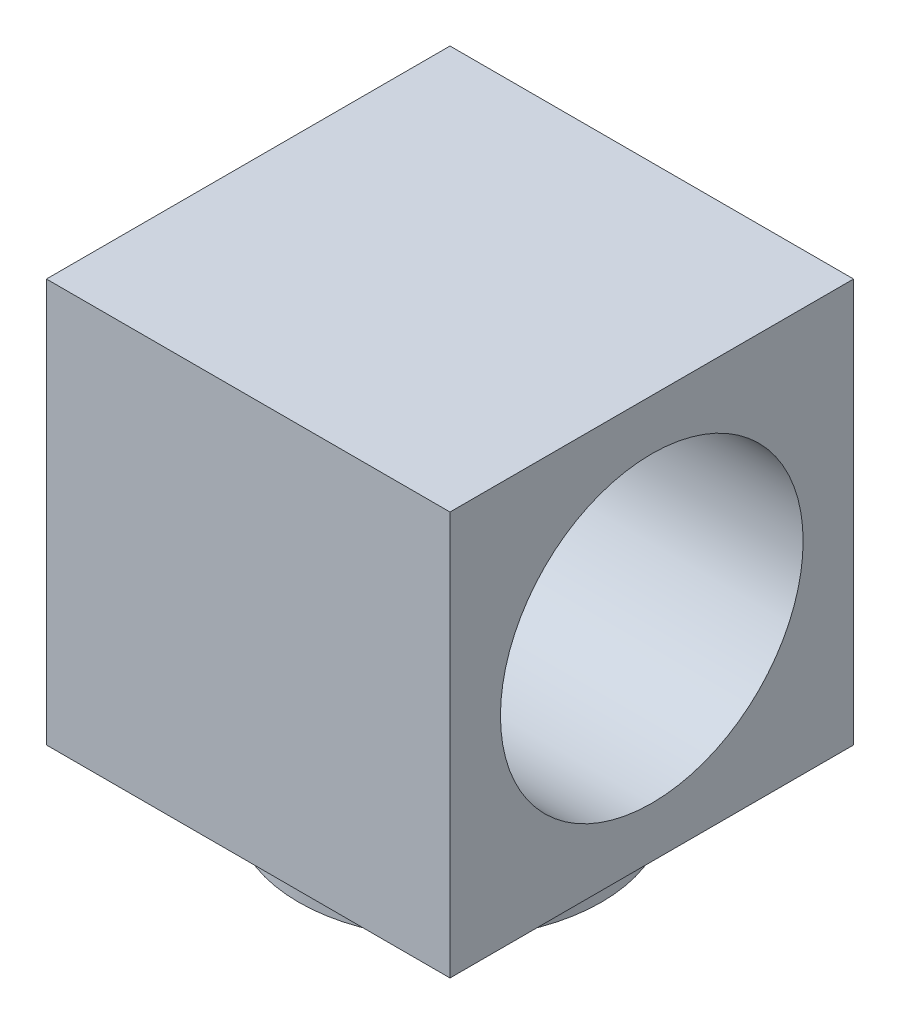
ISO-10303-21;
HEADER;
FILE_DESCRIPTION(('STEP AP214'),'2;1');
FILE_NAME('part.step','',(''),(''),'','','');
FILE_SCHEMA(('AUTOMOTIVE_DESIGN { 1 0 10303 214 1 1 1 1 }'));
ENDSEC;
DATA;
#1=APPLICATION_CONTEXT('core data for automotive mechanical design processes');
#2=APPLICATION_PROTOCOL_DEFINITION('international standard','automotive_design',2000,#1);
#3=PRODUCT_CONTEXT('',#1,'mechanical');
#4=PRODUCT('Part','Part','',(#3));
#5=PRODUCT_RELATED_PRODUCT_CATEGORY('part','',(#4));
#6=PRODUCT_DEFINITION_FORMATION('','',#4);
#7=PRODUCT_DEFINITION_CONTEXT('part definition',#1,'design');
#8=PRODUCT_DEFINITION('design','',#6,#7);
#9=PRODUCT_DEFINITION_SHAPE('','',#8);
#10=(LENGTH_UNIT() NAMED_UNIT(*) SI_UNIT(.MILLI.,.METRE.));
#11=(NAMED_UNIT(*) PLANE_ANGLE_UNIT() SI_UNIT($,.RADIAN.));
#12=(NAMED_UNIT(*) SI_UNIT($,.STERADIAN.) SOLID_ANGLE_UNIT());
#13=UNCERTAINTY_MEASURE_WITH_UNIT(LENGTH_MEASURE(1.E-05),#10,'distance_accuracy_value','');
#14=(GEOMETRIC_REPRESENTATION_CONTEXT(3) GLOBAL_UNCERTAINTY_ASSIGNED_CONTEXT((#13)) GLOBAL_UNIT_ASSIGNED_CONTEXT((#10,
#11,#12)) REPRESENTATION_CONTEXT('',''));
#15=CARTESIAN_POINT('',(0.,0.,0.));
#16=DIRECTION('',(0.,0.,1.));
#17=DIRECTION('',(1.,0.,0.));
#18=AXIS2_PLACEMENT_3D('',#15,#16,#17);
#19=CARTESIAN_POINT('',(0.,0.,20.));
#20=DIRECTION('',(1.,0.,0.));
#21=DIRECTION('',(0.,0.,-1.));
#22=AXIS2_PLACEMENT_3D('',#19,#20,#21);
#23=PLANE('',#22);
#24=CARTESIAN_POINT('',(0.,10.,10.));
#25=DIRECTION('',(1.,0.,0.));
#26=DIRECTION('',(0.,0.,-1.));
#27=AXIS2_PLACEMENT_3D('',#24,#25,#26);
#28=CIRCLE('',#27,7.5);
#29=CARTESIAN_POINT('',(0.,10.,2.5));
#30=VERTEX_POINT('',#29);
#31=EDGE_CURVE('E110',#30,#30,#28,.T.);
#32=ORIENTED_EDGE('',*,*,#31,.T.);
#33=EDGE_LOOP('',(#32));
#34=FACE_BOUND('',#33,.T.);
#35=DIRECTION('',(0.,-1.,0.));
#36=VECTOR('',#35,1.);
#37=CARTESIAN_POINT('',(0.,0.,0.));
#38=LINE('',#37,#36);
#39=CARTESIAN_POINT('',(0.,20.,0.));
#40=VERTEX_POINT('',#39);
#41=CARTESIAN_POINT('',(0.,0.,0.));
#42=VERTEX_POINT('',#41);
#43=EDGE_CURVE('E107',#40,#42,#38,.T.);
#44=ORIENTED_EDGE('',*,*,#43,.T.);
#45=DIRECTION('',(0.,0.,-1.));
#46=VECTOR('',#45,1.);
#47=CARTESIAN_POINT('',(0.,0.,20.));
#48=LINE('',#47,#46);
#49=CARTESIAN_POINT('',(0.,0.,20.));
#50=VERTEX_POINT('',#49);
#51=EDGE_CURVE('E49',#50,#42,#48,.T.);
#52=ORIENTED_EDGE('',*,*,#51,.F.);
#53=DIRECTION('',(0.,-1.,0.));
#54=VECTOR('',#53,1.);
#55=CARTESIAN_POINT('',(0.,0.,20.));
#56=LINE('',#55,#54);
#57=CARTESIAN_POINT('',(0.,20.,20.));
#58=VERTEX_POINT('',#57);
#59=EDGE_CURVE('E93',#58,#50,#56,.T.);
#60=ORIENTED_EDGE('',*,*,#59,.F.);
#61=DIRECTION('',(0.,0.,-1.));
#62=VECTOR('',#61,1.);
#63=CARTESIAN_POINT('',(0.,20.,20.));
#64=LINE('',#63,#62);
#65=EDGE_CURVE('E103',#58,#40,#64,.T.);
#66=ORIENTED_EDGE('',*,*,#65,.T.);
#67=EDGE_LOOP('',(#44,#52,#60,#66));
#68=FACE_BOUND('',#67,.T.);
#69=ADVANCED_FACE('F41',(#34,#68),#23,.F.);
#70=CARTESIAN_POINT('',(0.,0.,20.));
#71=DIRECTION('',(0.,1.,0.));
#72=DIRECTION('',(0.,0.,1.));
#73=AXIS2_PLACEMENT_3D('',#70,#71,#72);
#74=PLANE('',#73);
#75=CARTESIAN_POINT('',(10.,0.,10.));
#76=DIRECTION('',(0.,1.,0.));
#77=DIRECTION('',(0.,0.,1.));
#78=AXIS2_PLACEMENT_3D('',#75,#76,#77);
#79=CIRCLE('',#78,7.5);
#80=CARTESIAN_POINT('',(10.,0.,17.5));
#81=VERTEX_POINT('',#80);
#82=EDGE_CURVE('E11',#81,#81,#79,.F.);
#83=ORIENTED_EDGE('',*,*,#82,.F.);
#84=EDGE_LOOP('',(#83));
#85=FACE_BOUND('',#84,.T.);
#86=DIRECTION('',(1.,0.,0.));
#87=VECTOR('',#86,1.);
#88=CARTESIAN_POINT('',(0.,0.,0.));
#89=LINE('',#88,#87);
#90=CARTESIAN_POINT('',(20.,0.,0.));
#91=VERTEX_POINT('',#90);
#92=EDGE_CURVE('E98',#42,#91,#89,.T.);
#93=ORIENTED_EDGE('',*,*,#92,.T.);
#94=DIRECTION('',(0.,0.,-1.));
#95=VECTOR('',#94,1.);
#96=CARTESIAN_POINT('',(20.,0.,20.));
#97=LINE('',#96,#95);
#98=CARTESIAN_POINT('',(20.,0.,20.));
#99=VERTEX_POINT('',#98);
#100=EDGE_CURVE('E96',#99,#91,#97,.T.);
#101=ORIENTED_EDGE('',*,*,#100,.F.);
#102=DIRECTION('',(1.,0.,0.));
#103=VECTOR('',#102,1.);
#104=CARTESIAN_POINT('',(0.,0.,20.));
#105=LINE('',#104,#103);
#106=EDGE_CURVE('E88',#50,#99,#105,.T.);
#107=ORIENTED_EDGE('',*,*,#106,.F.);
#108=ORIENTED_EDGE('',*,*,#51,.T.);
#109=EDGE_LOOP('',(#93,#101,#107,#108));
#110=FACE_BOUND('',#109,.T.);
#111=ADVANCED_FACE('F97',(#85,#110),#74,.F.);
#112=CARTESIAN_POINT('',(20.,0.,20.));
#113=DIRECTION('',(-1.,0.,0.));
#114=DIRECTION('',(0.,0.,1.));
#115=AXIS2_PLACEMENT_3D('',#112,#113,#114);
#116=PLANE('',#115);
#117=CARTESIAN_POINT('',(20.,10.,10.));
#118=DIRECTION('',(1.,0.,0.));
#119=DIRECTION('',(0.,0.,-1.));
#120=AXIS2_PLACEMENT_3D('',#117,#118,#119);
#121=CIRCLE('',#120,7.5);
#122=CARTESIAN_POINT('',(20.,10.,2.5));
#123=VERTEX_POINT('',#122);
#124=EDGE_CURVE('E142',#123,#123,#121,.T.);
#125=ORIENTED_EDGE('',*,*,#124,.F.);
#126=EDGE_LOOP('',(#125));
#127=FACE_BOUND('',#126,.T.);
#128=DIRECTION('',(0.,1.,0.));
#129=VECTOR('',#128,1.);
#130=CARTESIAN_POINT('',(20.,0.,0.));
#131=LINE('',#130,#129);
#132=CARTESIAN_POINT('',(20.,20.,0.));
#133=VERTEX_POINT('',#132);
#134=EDGE_CURVE('E74',#91,#133,#131,.T.);
#135=ORIENTED_EDGE('',*,*,#134,.T.);
#136=DIRECTION('',(0.,0.,-1.));
#137=VECTOR('',#136,1.);
#138=CARTESIAN_POINT('',(20.,20.,20.));
#139=LINE('',#138,#137);
#140=CARTESIAN_POINT('',(20.,20.,20.));
#141=VERTEX_POINT('',#140);
#142=EDGE_CURVE('E99',#141,#133,#139,.T.);
#143=ORIENTED_EDGE('',*,*,#142,.F.);
#144=DIRECTION('',(0.,1.,0.));
#145=VECTOR('',#144,1.);
#146=CARTESIAN_POINT('',(20.,0.,20.));
#147=LINE('',#146,#145);
#148=EDGE_CURVE('E91',#99,#141,#147,.T.);
#149=ORIENTED_EDGE('',*,*,#148,.F.);
#150=ORIENTED_EDGE('',*,*,#100,.T.);
#151=EDGE_LOOP('',(#135,#143,#149,#150));
#152=FACE_BOUND('',#151,.T.);
#153=ADVANCED_FACE('F101',(#127,#152),#116,.F.);
#154=CARTESIAN_POINT('',(0.,20.,20.));
#155=DIRECTION('',(0.,-1.,0.));
#156=DIRECTION('',(0.,0.,-1.));
#157=AXIS2_PLACEMENT_3D('',#154,#155,#156);
#158=PLANE('',#157);
#159=DIRECTION('',(-1.,0.,0.));
#160=VECTOR('',#159,1.);
#161=CARTESIAN_POINT('',(0.,20.,0.));
#162=LINE('',#161,#160);
#163=EDGE_CURVE('E80',#133,#40,#162,.T.);
#164=ORIENTED_EDGE('',*,*,#163,.T.);
#165=ORIENTED_EDGE('',*,*,#65,.F.);
#166=DIRECTION('',(-1.,0.,0.));
#167=VECTOR('',#166,1.);
#168=CARTESIAN_POINT('',(0.,20.,20.));
#169=LINE('',#168,#167);
#170=EDGE_CURVE('E57',#141,#58,#169,.T.);
#171=ORIENTED_EDGE('',*,*,#170,.F.);
#172=ORIENTED_EDGE('',*,*,#142,.T.);
#173=EDGE_LOOP('',(#164,#165,#171,#172));
#174=FACE_BOUND('',#173,.T.);
#175=ADVANCED_FACE('F130',(#174),#158,.F.);
#176=CARTESIAN_POINT('',(0.,0.,20.));
#177=DIRECTION('',(0.,0.,-1.));
#178=DIRECTION('',(-1.,0.,0.));
#179=AXIS2_PLACEMENT_3D('',#176,#177,#178);
#180=PLANE('',#179);
#181=ORIENTED_EDGE('',*,*,#59,.T.);
#182=ORIENTED_EDGE('',*,*,#106,.T.);
#183=ORIENTED_EDGE('',*,*,#148,.T.);
#184=ORIENTED_EDGE('',*,*,#170,.T.);
#185=EDGE_LOOP('',(#181,#182,#183,#184));
#186=FACE_BOUND('',#185,.T.);
#187=ADVANCED_FACE('F89',(#186),#180,.F.);
#188=CARTESIAN_POINT('',(0.,0.,0.));
#189=DIRECTION('',(0.,0.,-1.));
#190=DIRECTION('',(-1.,0.,0.));
#191=AXIS2_PLACEMENT_3D('',#188,#189,#190);
#192=PLANE('',#191);
#193=ORIENTED_EDGE('',*,*,#43,.F.);
#194=ORIENTED_EDGE('',*,*,#163,.F.);
#195=ORIENTED_EDGE('',*,*,#134,.F.);
#196=ORIENTED_EDGE('',*,*,#92,.F.);
#197=EDGE_LOOP('',(#193,#194,#195,#196));
#198=FACE_BOUND('',#197,.T.);
#199=ADVANCED_FACE('F118',(#198),#192,.T.);
#200=CARTESIAN_POINT('',(0.,10.,10.));
#201=DIRECTION('',(1.,0.,0.));
#202=DIRECTION('',(0.,0.,-1.));
#203=AXIS2_PLACEMENT_3D('',#200,#201,#202);
#204=CYLINDRICAL_SURFACE('',#203,7.5);
#205=ORIENTED_EDGE('',*,*,#31,.F.);
#206=EDGE_LOOP('',(#205));
#207=FACE_BOUND('',#206,.T.);
#208=ORIENTED_EDGE('',*,*,#124,.T.);
#209=EDGE_LOOP('',(#208));
#210=FACE_BOUND('',#209,.T.);
#211=ADVANCED_FACE('F120',(#207,#210),#204,.F.);
#212=CARTESIAN_POINT('',(10.,-3.,10.));
#213=DIRECTION('',(0.,-1.,0.));
#214=DIRECTION('',(0.,0.,-1.));
#215=AXIS2_PLACEMENT_3D('',#212,#213,#214);
#216=PLANE('',#215);
#217=CARTESIAN_POINT('',(10.,-3.,10.));
#218=DIRECTION('',(0.,-1.,0.));
#219=DIRECTION('',(0.,0.,-1.));
#220=AXIS2_PLACEMENT_3D('',#217,#218,#219);
#221=CIRCLE('',#220,7.5);
#222=CARTESIAN_POINT('',(10.,-3.,2.5));
#223=VERTEX_POINT('',#222);
#224=EDGE_CURVE('E145',#223,#223,#221,.T.);
#225=ORIENTED_EDGE('',*,*,#224,.T.);
#226=EDGE_LOOP('',(#225));
#227=FACE_BOUND('',#226,.T.);
#228=CARTESIAN_POINT('',(10.,-3.,10.));
#229=DIRECTION('',(0.,-1.,0.));
#230=DIRECTION('',(0.,0.,-1.));
#231=AXIS2_PLACEMENT_3D('',#228,#229,#230);
#232=CIRCLE('',#231,6.5);
#233=CARTESIAN_POINT('',(10.,-3.,3.5));
#234=VERTEX_POINT('',#233);
#235=EDGE_CURVE('E150',#234,#234,#232,.T.);
#236=ORIENTED_EDGE('',*,*,#235,.F.);
#237=EDGE_LOOP('',(#236));
#238=FACE_BOUND('',#237,.T.);
#239=ADVANCED_FACE('F127',(#227,#238),#216,.T.);
#240=CARTESIAN_POINT('',(10.,-3.,10.));
#241=DIRECTION('',(0.,1.,0.));
#242=DIRECTION('',(0.,0.,1.));
#243=AXIS2_PLACEMENT_3D('',#240,#241,#242);
#244=CYLINDRICAL_SURFACE('',#243,7.5);
#245=ORIENTED_EDGE('',*,*,#224,.F.);
#246=EDGE_LOOP('',(#245));
#247=FACE_BOUND('',#246,.T.);
#248=ORIENTED_EDGE('',*,*,#82,.T.);
#249=EDGE_LOOP('',(#248));
#250=FACE_BOUND('',#249,.T.);
#251=ADVANCED_FACE('F161',(#247,#250),#244,.T.);
#252=CARTESIAN_POINT('',(10.,-3.,10.));
#253=DIRECTION('',(0.,1.,0.));
#254=DIRECTION('',(0.,0.,1.));
#255=AXIS2_PLACEMENT_3D('',#252,#253,#254);
#256=CYLINDRICAL_SURFACE('',#255,6.5);
#257=ORIENTED_EDGE('',*,*,#235,.T.);
#258=EDGE_LOOP('',(#257));
#259=FACE_BOUND('',#258,.T.);
#260=CARTESIAN_POINT('',(10.,0.,10.));
#261=DIRECTION('',(0.,-1.,0.));
#262=DIRECTION('',(0.,0.,-1.));
#263=AXIS2_PLACEMENT_3D('',#260,#261,#262);
#264=CIRCLE('',#263,6.5);
#265=CARTESIAN_POINT('',(10.,0.,3.5));
#266=VERTEX_POINT('',#265);
#267=EDGE_CURVE('E151',#266,#266,#264,.T.);
#268=ORIENTED_EDGE('',*,*,#267,.F.);
#269=EDGE_LOOP('',(#268));
#270=FACE_BOUND('',#269,.T.);
#271=ADVANCED_FACE('F157',(#259,#270),#256,.F.);
#272=ORIENTED_EDGE('',*,*,#267,.T.);
#273=EDGE_LOOP('',(#272));
#274=FACE_BOUND('',#273,.T.);
#275=ADVANCED_FACE('F139',(#274),#74,.F.);
#276=CLOSED_SHELL('',(#69,#111,#153,#175,#187,#199,#211,#239,#251,#271,#275));
#277=MANIFOLD_SOLID_BREP('B2',#276);
#278=ADVANCED_BREP_SHAPE_REPRESENTATION('',(#18,#277),#14);
#279=SHAPE_DEFINITION_REPRESENTATION(#9,#278);
ENDSEC;
END-ISO-10303-21;
